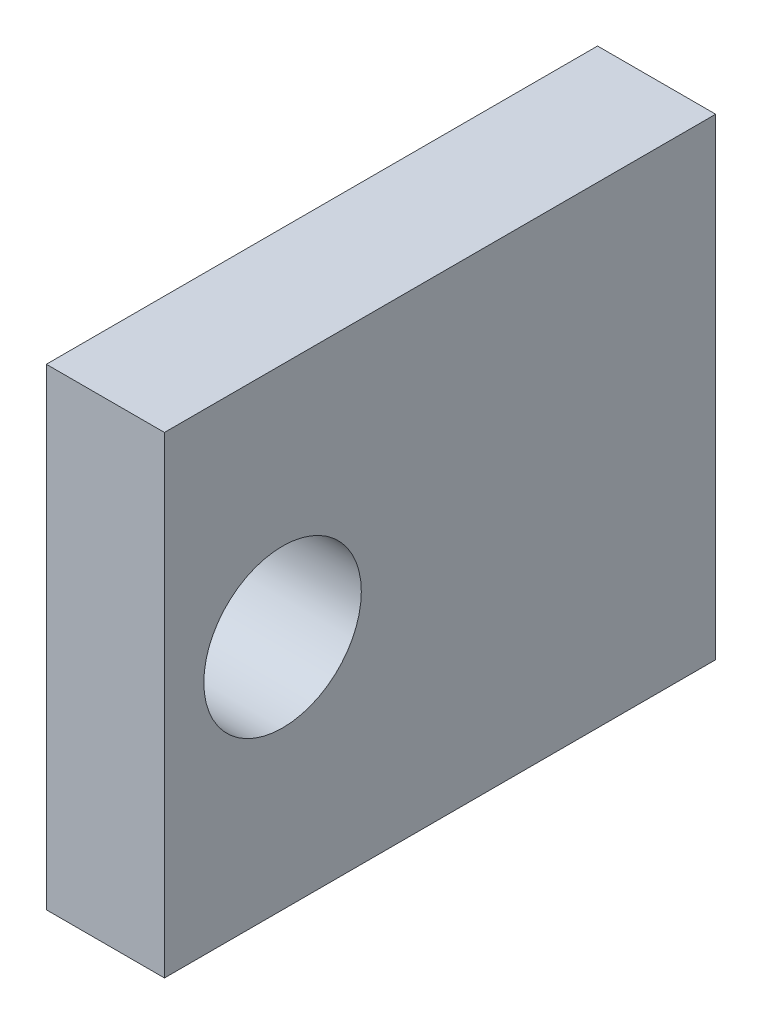
ISO-10303-21;
HEADER;
FILE_DESCRIPTION(('STEP AP214'),'2;1');
FILE_NAME('part.step','',(''),(''),'','','');
FILE_SCHEMA(('AUTOMOTIVE_DESIGN { 1 0 10303 214 1 1 1 1 }'));
ENDSEC;
DATA;
#1=APPLICATION_CONTEXT('core data for automotive mechanical design processes');
#2=APPLICATION_PROTOCOL_DEFINITION('international standard','automotive_design',2000,#1);
#3=PRODUCT_CONTEXT('',#1,'mechanical');
#4=PRODUCT('Part','Part','',(#3));
#5=PRODUCT_RELATED_PRODUCT_CATEGORY('part','',(#4));
#6=PRODUCT_DEFINITION_FORMATION('','',#4);
#7=PRODUCT_DEFINITION_CONTEXT('part definition',#1,'design');
#8=PRODUCT_DEFINITION('design','',#6,#7);
#9=PRODUCT_DEFINITION_SHAPE('','',#8);
#10=(LENGTH_UNIT() NAMED_UNIT(*) SI_UNIT(.MILLI.,.METRE.));
#11=(NAMED_UNIT(*) PLANE_ANGLE_UNIT() SI_UNIT($,.RADIAN.));
#12=(NAMED_UNIT(*) SI_UNIT($,.STERADIAN.) SOLID_ANGLE_UNIT());
#13=UNCERTAINTY_MEASURE_WITH_UNIT(LENGTH_MEASURE(1.E-05),#10,'distance_accuracy_value','');
#14=(GEOMETRIC_REPRESENTATION_CONTEXT(3) GLOBAL_UNCERTAINTY_ASSIGNED_CONTEXT((#13)) GLOBAL_UNIT_ASSIGNED_CONTEXT((#10,
#11,#12)) REPRESENTATION_CONTEXT('',''));
#15=CARTESIAN_POINT('',(0.,0.,0.));
#16=DIRECTION('',(0.,0.,1.));
#17=DIRECTION('',(1.,0.,0.));
#18=AXIS2_PLACEMENT_3D('',#15,#16,#17);
#19=CARTESIAN_POINT('',(9.525,0.,0.));
#20=DIRECTION('',(-1.,0.,0.));
#21=DIRECTION('',(0.,0.,1.));
#22=AXIS2_PLACEMENT_3D('',#19,#20,#21);
#23=PLANE('',#22);
#24=DIRECTION('',(0.,1.,0.));
#25=VECTOR('',#24,1.);
#26=CARTESIAN_POINT('',(9.525,-19.05,-22.225));
#27=LINE('',#26,#25);
#28=CARTESIAN_POINT('',(9.525,-19.05,-22.225));
#29=VERTEX_POINT('',#28);
#30=CARTESIAN_POINT('',(9.525,19.05,-22.225));
#31=VERTEX_POINT('',#30);
#32=EDGE_CURVE('E97',#29,#31,#27,.T.);
#33=ORIENTED_EDGE('',*,*,#32,.T.);
#34=DIRECTION('',(0.,0.,1.));
#35=VECTOR('',#34,1.);
#36=CARTESIAN_POINT('',(9.525,19.05,22.225));
#37=LINE('',#36,#35);
#38=CARTESIAN_POINT('',(9.525,19.05,22.225));
#39=VERTEX_POINT('',#38);
#40=EDGE_CURVE('E92',#31,#39,#37,.T.);
#41=ORIENTED_EDGE('',*,*,#40,.T.);
#42=DIRECTION('',(0.,-1.,0.));
#43=VECTOR('',#42,1.);
#44=CARTESIAN_POINT('',(9.525,-19.05,22.225));
#45=LINE('',#44,#43);
#46=CARTESIAN_POINT('',(9.525,-19.05,22.225));
#47=VERTEX_POINT('',#46);
#48=EDGE_CURVE('E95',#39,#47,#45,.T.);
#49=ORIENTED_EDGE('',*,*,#48,.T.);
#50=DIRECTION('',(0.,0.,-1.));
#51=VECTOR('',#50,1.);
#52=CARTESIAN_POINT('',(9.525,-19.05,22.225));
#53=LINE('',#52,#51);
#54=EDGE_CURVE('E62',#47,#29,#53,.T.);
#55=ORIENTED_EDGE('',*,*,#54,.T.);
#56=EDGE_LOOP('',(#33,#41,#49,#55));
#57=FACE_BOUND('',#56,.T.);
#58=CARTESIAN_POINT('',(9.525,0.,12.7));
#59=DIRECTION('',(1.,0.,0.));
#60=DIRECTION('',(0.,0.,-1.));
#61=AXIS2_PLACEMENT_3D('',#58,#59,#60);
#62=CIRCLE('',#61,6.35);
#63=CARTESIAN_POINT('',(9.525,0.,19.05));
#64=VERTEX_POINT('',#63);
#65=EDGE_CURVE('E112',#64,#64,#62,.T.);
#66=ORIENTED_EDGE('',*,*,#65,.F.);
#67=EDGE_LOOP('',(#66));
#68=FACE_BOUND('',#67,.T.);
#69=ADVANCED_FACE('F45',(#57,#68),#23,.F.);
#70=CARTESIAN_POINT('',(0.,0.,0.));
#71=DIRECTION('',(-1.,0.,0.));
#72=DIRECTION('',(0.,0.,1.));
#73=AXIS2_PLACEMENT_3D('',#70,#71,#72);
#74=PLANE('',#73);
#75=DIRECTION('',(0.,1.,0.));
#76=VECTOR('',#75,1.);
#77=CARTESIAN_POINT('',(0.,-19.05,-22.225));
#78=LINE('',#77,#76);
#79=CARTESIAN_POINT('',(0.,-19.05,-22.225));
#80=VERTEX_POINT('',#79);
#81=CARTESIAN_POINT('',(0.,19.05,-22.225));
#82=VERTEX_POINT('',#81);
#83=EDGE_CURVE('E109',#80,#82,#78,.T.);
#84=ORIENTED_EDGE('',*,*,#83,.F.);
#85=DIRECTION('',(0.,0.,-1.));
#86=VECTOR('',#85,1.);
#87=CARTESIAN_POINT('',(0.,-19.05,22.225));
#88=LINE('',#87,#86);
#89=CARTESIAN_POINT('',(0.,-19.05,22.225));
#90=VERTEX_POINT('',#89);
#91=EDGE_CURVE('E85',#90,#80,#88,.T.);
#92=ORIENTED_EDGE('',*,*,#91,.F.);
#93=DIRECTION('',(0.,-1.,0.));
#94=VECTOR('',#93,1.);
#95=CARTESIAN_POINT('',(0.,-19.05,22.225));
#96=LINE('',#95,#94);
#97=CARTESIAN_POINT('',(0.,19.05,22.225));
#98=VERTEX_POINT('',#97);
#99=EDGE_CURVE('E79',#98,#90,#96,.T.);
#100=ORIENTED_EDGE('',*,*,#99,.F.);
#101=DIRECTION('',(0.,0.,1.));
#102=VECTOR('',#101,1.);
#103=CARTESIAN_POINT('',(0.,19.05,22.225));
#104=LINE('',#103,#102);
#105=EDGE_CURVE('E101',#82,#98,#104,.T.);
#106=ORIENTED_EDGE('',*,*,#105,.F.);
#107=EDGE_LOOP('',(#84,#92,#100,#106));
#108=FACE_BOUND('',#107,.T.);
#109=CARTESIAN_POINT('',(0.,0.,12.7));
#110=DIRECTION('',(1.,0.,0.));
#111=DIRECTION('',(0.,0.,-1.));
#112=AXIS2_PLACEMENT_3D('',#109,#110,#111);
#113=CIRCLE('',#112,6.35);
#114=CARTESIAN_POINT('',(0.,0.,19.05));
#115=VERTEX_POINT('',#114);
#116=EDGE_CURVE('E124',#115,#115,#113,.T.);
#117=ORIENTED_EDGE('',*,*,#116,.T.);
#118=EDGE_LOOP('',(#117));
#119=FACE_BOUND('',#118,.T.);
#120=ADVANCED_FACE('F120',(#108,#119),#74,.T.);
#121=CARTESIAN_POINT('',(9.525,-19.05,-22.225));
#122=DIRECTION('',(0.,0.,1.));
#123=DIRECTION('',(1.,0.,0.));
#124=AXIS2_PLACEMENT_3D('',#121,#122,#123);
#125=PLANE('',#124);
#126=ORIENTED_EDGE('',*,*,#83,.T.);
#127=DIRECTION('',(-1.,0.,0.));
#128=VECTOR('',#127,1.);
#129=CARTESIAN_POINT('',(9.525,19.05,-22.225));
#130=LINE('',#129,#128);
#131=EDGE_CURVE('E13',#31,#82,#130,.T.);
#132=ORIENTED_EDGE('',*,*,#131,.F.);
#133=ORIENTED_EDGE('',*,*,#32,.F.);
#134=DIRECTION('',(-1.,0.,0.));
#135=VECTOR('',#134,1.);
#136=CARTESIAN_POINT('',(9.525,-19.05,-22.225));
#137=LINE('',#136,#135);
#138=EDGE_CURVE('E105',#29,#80,#137,.T.);
#139=ORIENTED_EDGE('',*,*,#138,.T.);
#140=EDGE_LOOP('',(#126,#132,#133,#139));
#141=FACE_BOUND('',#140,.T.);
#142=ADVANCED_FACE('F47',(#141),#125,.F.);
#143=CARTESIAN_POINT('',(9.525,19.05,22.225));
#144=DIRECTION('',(0.,-1.,0.));
#145=DIRECTION('',(0.,0.,-1.));
#146=AXIS2_PLACEMENT_3D('',#143,#144,#145);
#147=PLANE('',#146);
#148=ORIENTED_EDGE('',*,*,#105,.T.);
#149=DIRECTION('',(-1.,0.,0.));
#150=VECTOR('',#149,1.);
#151=CARTESIAN_POINT('',(9.525,19.05,22.225));
#152=LINE('',#151,#150);
#153=EDGE_CURVE('E54',#39,#98,#152,.T.);
#154=ORIENTED_EDGE('',*,*,#153,.F.);
#155=ORIENTED_EDGE('',*,*,#40,.F.);
#156=ORIENTED_EDGE('',*,*,#131,.T.);
#157=EDGE_LOOP('',(#148,#154,#155,#156));
#158=FACE_BOUND('',#157,.T.);
#159=ADVANCED_FACE('F100',(#158),#147,.F.);
#160=CARTESIAN_POINT('',(9.525,-19.05,22.225));
#161=DIRECTION('',(0.,0.,-1.));
#162=DIRECTION('',(-1.,0.,0.));
#163=AXIS2_PLACEMENT_3D('',#160,#161,#162);
#164=PLANE('',#163);
#165=ORIENTED_EDGE('',*,*,#99,.T.);
#166=DIRECTION('',(-1.,0.,0.));
#167=VECTOR('',#166,1.);
#168=CARTESIAN_POINT('',(9.525,-19.05,22.225));
#169=LINE('',#168,#167);
#170=EDGE_CURVE('E102',#47,#90,#169,.T.);
#171=ORIENTED_EDGE('',*,*,#170,.F.);
#172=ORIENTED_EDGE('',*,*,#48,.F.);
#173=ORIENTED_EDGE('',*,*,#153,.T.);
#174=EDGE_LOOP('',(#165,#171,#172,#173));
#175=FACE_BOUND('',#174,.T.);
#176=ADVANCED_FACE('F103',(#175),#164,.F.);
#177=CARTESIAN_POINT('',(9.525,-19.05,22.225));
#178=DIRECTION('',(0.,1.,0.));
#179=DIRECTION('',(0.,0.,1.));
#180=AXIS2_PLACEMENT_3D('',#177,#178,#179);
#181=PLANE('',#180);
#182=ORIENTED_EDGE('',*,*,#91,.T.);
#183=ORIENTED_EDGE('',*,*,#138,.F.);
#184=ORIENTED_EDGE('',*,*,#54,.F.);
#185=ORIENTED_EDGE('',*,*,#170,.T.);
#186=EDGE_LOOP('',(#182,#183,#184,#185));
#187=FACE_BOUND('',#186,.T.);
#188=ADVANCED_FACE('F117',(#187),#181,.F.);
#189=CARTESIAN_POINT('',(9.525,0.,12.7));
#190=DIRECTION('',(-1.,0.,0.));
#191=DIRECTION('',(0.,0.,1.));
#192=AXIS2_PLACEMENT_3D('',#189,#190,#191);
#193=CYLINDRICAL_SURFACE('',#192,6.35);
#194=CARTESIAN_POINT('',(9.525,0.,19.05));
#195=CARTESIAN_POINT('',(9.42578125,0.,19.05));
#196=CARTESIAN_POINT('',(9.3265625,0.,19.05));
#197=CARTESIAN_POINT('',(9.128125,0.,19.05));
#198=CARTESIAN_POINT('',(9.02890625,0.,19.05));
#199=CARTESIAN_POINT('',(8.83046875,0.,19.05));
#200=CARTESIAN_POINT('',(8.73125,0.,19.05));
#201=CARTESIAN_POINT('',(8.5328125,0.,19.05));
#202=CARTESIAN_POINT('',(8.43359375,0.,19.05));
#203=CARTESIAN_POINT('',(8.23515625,0.,19.05));
#204=CARTESIAN_POINT('',(8.1359375,0.,19.05));
#205=CARTESIAN_POINT('',(7.9375,0.,19.05));
#206=CARTESIAN_POINT('',(7.83828125,0.,19.05));
#207=CARTESIAN_POINT('',(7.63984375,0.,19.05));
#208=CARTESIAN_POINT('',(7.540625,0.,19.05));
#209=CARTESIAN_POINT('',(7.3421875,0.,19.05));
#210=CARTESIAN_POINT('',(7.24296875,0.,19.05));
#211=CARTESIAN_POINT('',(7.04453125,0.,19.05));
#212=CARTESIAN_POINT('',(6.9453125,0.,19.05));
#213=CARTESIAN_POINT('',(6.746875,0.,19.05));
#214=CARTESIAN_POINT('',(6.64765625,0.,19.05));
#215=CARTESIAN_POINT('',(6.44921875,0.,19.05));
#216=CARTESIAN_POINT('',(6.35,0.,19.05));
#217=CARTESIAN_POINT('',(6.1515625,0.,19.05));
#218=CARTESIAN_POINT('',(6.05234375,0.,19.05));
#219=CARTESIAN_POINT('',(5.85390625,0.,19.05));
#220=CARTESIAN_POINT('',(5.7546875,0.,19.05));
#221=CARTESIAN_POINT('',(5.55625,0.,19.05));
#222=CARTESIAN_POINT('',(5.45703125,0.,19.05));
#223=CARTESIAN_POINT('',(5.25859375,0.,19.05));
#224=CARTESIAN_POINT('',(5.159375,0.,19.05));
#225=CARTESIAN_POINT('',(4.9609375,0.,19.05));
#226=CARTESIAN_POINT('',(4.86171875,0.,19.05));
#227=CARTESIAN_POINT('',(4.66328125,0.,19.05));
#228=CARTESIAN_POINT('',(4.5640625,0.,19.05));
#229=CARTESIAN_POINT('',(4.365625,0.,19.05));
#230=CARTESIAN_POINT('',(4.26640625,0.,19.05));
#231=CARTESIAN_POINT('',(4.06796875,0.,19.05));
#232=CARTESIAN_POINT('',(3.96875,0.,19.05));
#233=CARTESIAN_POINT('',(3.7703125,0.,19.05));
#234=CARTESIAN_POINT('',(3.67109375,0.,19.05));
#235=CARTESIAN_POINT('',(3.47265625,0.,19.05));
#236=CARTESIAN_POINT('',(3.3734375,0.,19.05));
#237=CARTESIAN_POINT('',(3.175,0.,19.05));
#238=CARTESIAN_POINT('',(3.07578125,0.,19.05));
#239=CARTESIAN_POINT('',(2.87734375,0.,19.05));
#240=CARTESIAN_POINT('',(2.778125,0.,19.05));
#241=CARTESIAN_POINT('',(2.5796875,0.,19.05));
#242=CARTESIAN_POINT('',(2.48046875,0.,19.05));
#243=CARTESIAN_POINT('',(2.28203125,0.,19.05));
#244=CARTESIAN_POINT('',(2.1828125,0.,19.05));
#245=CARTESIAN_POINT('',(1.984375,0.,19.05));
#246=CARTESIAN_POINT('',(1.88515625,0.,19.05));
#247=CARTESIAN_POINT('',(1.68671875,0.,19.05));
#248=CARTESIAN_POINT('',(1.5875,0.,19.05));
#249=CARTESIAN_POINT('',(1.3890625,0.,19.05));
#250=CARTESIAN_POINT('',(1.28984375,0.,19.05));
#251=CARTESIAN_POINT('',(1.09140625,0.,19.05));
#252=CARTESIAN_POINT('',(0.992187500000001,0.,19.05));
#253=CARTESIAN_POINT('',(0.793750000000001,0.,19.05));
#254=CARTESIAN_POINT('',(0.69453125,0.,19.05));
#255=CARTESIAN_POINT('',(0.49609375,0.,19.05));
#256=CARTESIAN_POINT('',(0.396875,0.,19.05));
#257=CARTESIAN_POINT('',(0.1984375,0.,19.05));
#258=CARTESIAN_POINT('',(0.0992187500000001,0.,19.05));
#259=CARTESIAN_POINT('',(0.,0.,19.05));
#260=B_SPLINE_CURVE_WITH_KNOTS('',3,(#194,#195,#196,#197,#198,#199,#200,#201,#202,#203,#204,
#205,#206,#207,#208,#209,#210,#211,#212,#213,#214,#215,#216,#217,#218,#219,#220,#221,#222,#223,
#224,#225,#226,#227,#228,#229,#230,#231,#232,#233,#234,#235,#236,#237,#238,#239,#240,#241,#242,
#243,#244,#245,#246,#247,#248,#249,#250,#251,#252,#253,#254,#255,#256,#257,#258,#259),
.UNSPECIFIED.,.F.,.F.,(4,2,2,2,2,2,2,2,2,2,2,2,2,2,2,2,2,2,2,2,2,2,2,2,2,2,2,2,2,2,2,2,4),(0.,
0.297656249999998,0.595312499999999,0.892968749999999,1.190625,1.48828125,1.7859375,2.08359375,
2.38125,2.67890625,2.9765625,3.27421875,3.571875,3.86953125,4.1671875,4.46484375,4.7625,
5.06015625,5.3578125,5.65546875,5.953125,6.25078125,6.5484375,6.84609375,7.14375,7.44140625,
7.7390625,8.03671875,8.334375,8.63203125,8.9296875,9.22734375,9.525),.UNSPECIFIED.);
#261=EDGE_CURVE('BSEAM130',#64,#115,#260,.T.);
#262=ORIENTED_EDGE('',*,*,#65,.T.);
#263=ORIENTED_EDGE('',*,*,#116,.F.);
#264=ORIENTED_EDGE('',*,*,#261,.T.);
#265=ORIENTED_EDGE('',*,*,#261,.F.);
#266=EDGE_LOOP('',(#262,#264,#263,#265));
#267=FACE_BOUND('',#266,.T.);
#268=ADVANCED_FACE('F130',(#267),#193,.F.);
#269=CLOSED_SHELL('',(#69,#120,#142,#159,#176,#188,#268));
#270=MANIFOLD_SOLID_BREP('B2',#269);
#271=ADVANCED_BREP_SHAPE_REPRESENTATION('',(#18,#270),#14);
#272=SHAPE_DEFINITION_REPRESENTATION(#9,#271);
ENDSEC;
END-ISO-10303-21;
